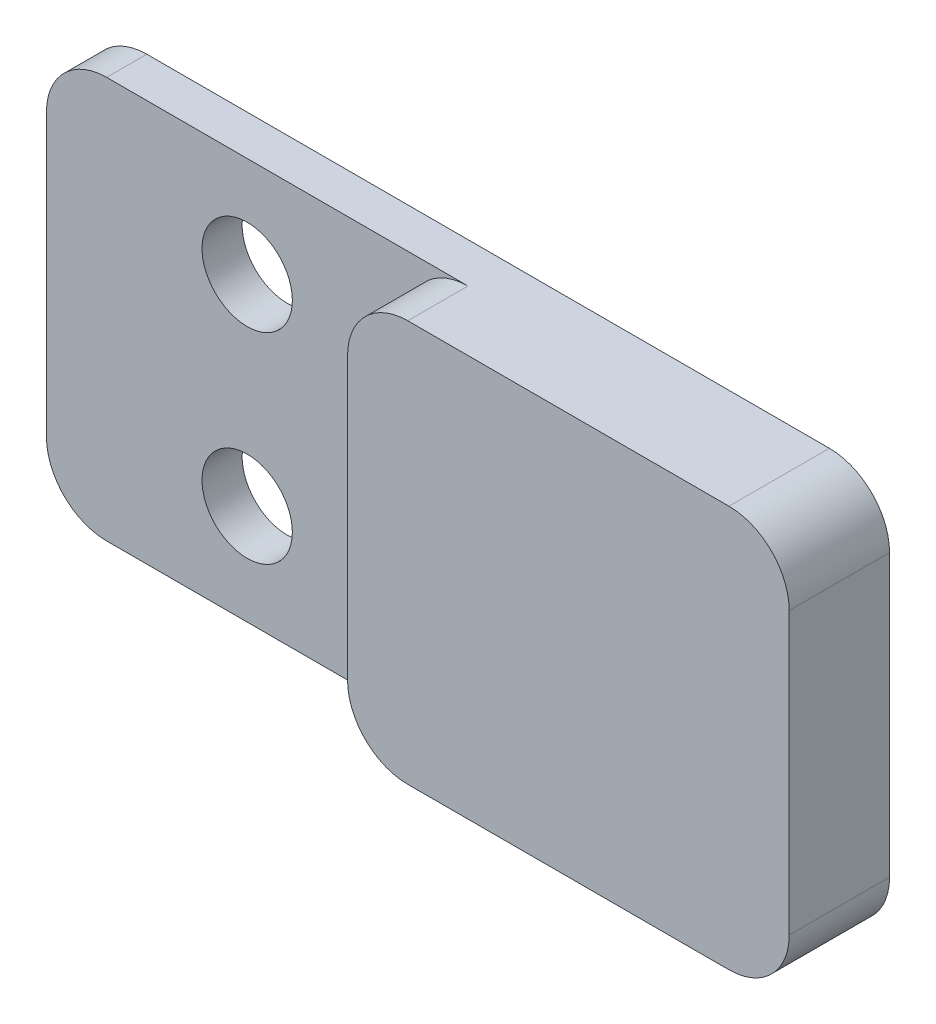
ISO-10303-21;
HEADER;
FILE_DESCRIPTION(('STEP AP214'),'2;1');
FILE_NAME('part.step','',(''),(''),'','','');
FILE_SCHEMA(('AUTOMOTIVE_DESIGN { 1 0 10303 214 1 1 1 1 }'));
ENDSEC;
DATA;
#1=APPLICATION_CONTEXT('core data for automotive mechanical design processes');
#2=APPLICATION_PROTOCOL_DEFINITION('international standard','automotive_design',2000,#1);
#3=PRODUCT_CONTEXT('',#1,'mechanical');
#4=PRODUCT('Part','Part','',(#3));
#5=PRODUCT_RELATED_PRODUCT_CATEGORY('part','',(#4));
#6=PRODUCT_DEFINITION_FORMATION('','',#4);
#7=PRODUCT_DEFINITION_CONTEXT('part definition',#1,'design');
#8=PRODUCT_DEFINITION('design','',#6,#7);
#9=PRODUCT_DEFINITION_SHAPE('','',#8);
#10=(LENGTH_UNIT() NAMED_UNIT(*) SI_UNIT(.MILLI.,.METRE.));
#11=(NAMED_UNIT(*) PLANE_ANGLE_UNIT() SI_UNIT($,.RADIAN.));
#12=(NAMED_UNIT(*) SI_UNIT($,.STERADIAN.) SOLID_ANGLE_UNIT());
#13=UNCERTAINTY_MEASURE_WITH_UNIT(LENGTH_MEASURE(1.E-05),#10,'distance_accuracy_value','');
#14=(GEOMETRIC_REPRESENTATION_CONTEXT(3) GLOBAL_UNCERTAINTY_ASSIGNED_CONTEXT((#13)) GLOBAL_UNIT_ASSIGNED_CONTEXT((#10,
#11,#12)) REPRESENTATION_CONTEXT('',''));
#15=CARTESIAN_POINT('',(0.,0.,0.));
#16=DIRECTION('',(0.,0.,1.));
#17=DIRECTION('',(1.,0.,0.));
#18=AXIS2_PLACEMENT_3D('',#15,#16,#17);
#19=CARTESIAN_POINT('',(20.494567618363,0.,2.));
#20=DIRECTION('',(1.,0.,0.));
#21=DIRECTION('',(0.,1.,0.));
#22=AXIS2_PLACEMENT_3D('',#19,#20,#21);
#23=PLANE('',#22);
#24=DIRECTION('',(0.,1.,0.));
#25=VECTOR('',#24,1.);
#26=CARTESIAN_POINT('',(20.494567618363,10.2863925862739,5.));
#27=LINE('',#26,#25);
#28=CARTESIAN_POINT('',(20.494567618363,-6.71360741372607,5.));
#29=VERTEX_POINT('',#28);
#30=CARTESIAN_POINT('',(20.494567618363,7.28639258627393,5.));
#31=VERTEX_POINT('',#30);
#32=EDGE_CURVE('E220',#29,#31,#27,.T.);
#33=ORIENTED_EDGE('',*,*,#32,.F.);
#34=DIRECTION('',(0.,0.,-1.));
#35=VECTOR('',#34,1.);
#36=CARTESIAN_POINT('',(20.494567618363,-6.71360741372607,0.));
#37=LINE('',#36,#35);
#38=CARTESIAN_POINT('',(20.494567618363,-6.71360741372607,0.));
#39=VERTEX_POINT('',#38);
#40=EDGE_CURVE('E195',#29,#39,#37,.T.);
#41=ORIENTED_EDGE('',*,*,#40,.T.);
#42=DIRECTION('',(0.,-1.,0.));
#43=VECTOR('',#42,1.);
#44=CARTESIAN_POINT('',(20.494567618363,0.,0.));
#45=LINE('',#44,#43);
#46=CARTESIAN_POINT('',(20.494567618363,7.28639258627393,0.));
#47=VERTEX_POINT('',#46);
#48=EDGE_CURVE('E242',#47,#39,#45,.T.);
#49=ORIENTED_EDGE('',*,*,#48,.F.);
#50=DIRECTION('',(0.,0.,-1.));
#51=VECTOR('',#50,1.);
#52=CARTESIAN_POINT('',(20.494567618363,7.28639258627393,2.));
#53=LINE('',#52,#51);
#54=EDGE_CURVE('E193',#47,#31,#53,.F.);
#55=ORIENTED_EDGE('',*,*,#54,.T.);
#56=EDGE_LOOP('',(#33,#41,#49,#55));
#57=FACE_BOUND('',#56,.T.);
#58=ADVANCED_FACE('F35',(#57),#23,.T.);
#59=CARTESIAN_POINT('',(0.,10.2863925862739,2.));
#60=DIRECTION('',(0.,1.,0.));
#61=DIRECTION('',(0.,0.,1.));
#62=AXIS2_PLACEMENT_3D('',#59,#60,#61);
#63=PLANE('',#62);
#64=DIRECTION('',(1.,0.,0.));
#65=VECTOR('',#64,1.);
#66=CARTESIAN_POINT('',(0.,10.2863925862739,2.));
#67=LINE('',#66,#65);
#68=CARTESIAN_POINT('',(-16.505432381637,10.2863925862739,2.));
#69=VERTEX_POINT('',#68);
#70=CARTESIAN_POINT('',(1.49456761836302,10.2863925862739,2.));
#71=VERTEX_POINT('',#70);
#72=EDGE_CURVE('E232',#69,#71,#67,.T.);
#73=ORIENTED_EDGE('',*,*,#72,.T.);
#74=DIRECTION('',(0.,0.,-1.));
#75=VECTOR('',#74,1.);
#76=CARTESIAN_POINT('',(1.49456761836302,10.2863925862739,5.));
#77=LINE('',#76,#75);
#78=CARTESIAN_POINT('',(1.49456761836302,10.2863925862739,5.));
#79=VERTEX_POINT('',#78);
#80=EDGE_CURVE('E180',#71,#79,#77,.F.);
#81=ORIENTED_EDGE('',*,*,#80,.T.);
#82=DIRECTION('',(-1.,0.,0.));
#83=VECTOR('',#82,1.);
#84=CARTESIAN_POINT('',(-1.50543238163698,10.2863925862739,5.));
#85=LINE('',#84,#83);
#86=CARTESIAN_POINT('',(17.494567618363,10.2863925862739,5.));
#87=VERTEX_POINT('',#86);
#88=EDGE_CURVE('E223',#87,#79,#85,.T.);
#89=ORIENTED_EDGE('',*,*,#88,.F.);
#90=DIRECTION('',(0.,0.,-1.));
#91=VECTOR('',#90,1.);
#92=CARTESIAN_POINT('',(17.494567618363,10.2863925862739,2.));
#93=LINE('',#92,#91);
#94=CARTESIAN_POINT('',(17.494567618363,10.2863925862739,0.));
#95=VERTEX_POINT('',#94);
#96=EDGE_CURVE('E177',#87,#95,#93,.T.);
#97=ORIENTED_EDGE('',*,*,#96,.T.);
#98=DIRECTION('',(1.,0.,0.));
#99=VECTOR('',#98,1.);
#100=CARTESIAN_POINT('',(0.,10.2863925862739,0.));
#101=LINE('',#100,#99);
#102=CARTESIAN_POINT('',(-16.505432381637,10.2863925862739,0.));
#103=VERTEX_POINT('',#102);
#104=EDGE_CURVE('E156',#103,#95,#101,.T.);
#105=ORIENTED_EDGE('',*,*,#104,.F.);
#106=DIRECTION('',(0.,0.,-1.));
#107=VECTOR('',#106,1.);
#108=CARTESIAN_POINT('',(-16.505432381637,10.2863925862739,2.));
#109=LINE('',#108,#107);
#110=EDGE_CURVE('E175',#103,#69,#109,.F.);
#111=ORIENTED_EDGE('',*,*,#110,.T.);
#112=EDGE_LOOP('',(#73,#81,#89,#97,#105,#111));
#113=FACE_BOUND('',#112,.T.);
#114=ADVANCED_FACE('F248',(#113),#63,.T.);
#115=CARTESIAN_POINT('',(-19.505432381637,0.,2.));
#116=DIRECTION('',(1.,0.,0.));
#117=DIRECTION('',(0.,1.,0.));
#118=AXIS2_PLACEMENT_3D('',#115,#116,#117);
#119=PLANE('',#118);
#120=DIRECTION('',(0.,-1.,0.));
#121=VECTOR('',#120,1.);
#122=CARTESIAN_POINT('',(-19.505432381637,0.,0.));
#123=LINE('',#122,#121);
#124=CARTESIAN_POINT('',(-19.505432381637,7.28639258627393,0.));
#125=VERTEX_POINT('',#124);
#126=CARTESIAN_POINT('',(-19.505432381637,-6.71360741372607,0.));
#127=VERTEX_POINT('',#126);
#128=EDGE_CURVE('E151',#125,#127,#123,.T.);
#129=ORIENTED_EDGE('',*,*,#128,.T.);
#130=DIRECTION('',(0.,0.,-1.));
#131=VECTOR('',#130,1.);
#132=CARTESIAN_POINT('',(-19.505432381637,-6.71360741372607,2.));
#133=LINE('',#132,#131);
#134=CARTESIAN_POINT('',(-19.505432381637,-6.71360741372607,2.));
#135=VERTEX_POINT('',#134);
#136=EDGE_CURVE('E50',#127,#135,#133,.F.);
#137=ORIENTED_EDGE('',*,*,#136,.T.);
#138=DIRECTION('',(0.,-1.,0.));
#139=VECTOR('',#138,1.);
#140=CARTESIAN_POINT('',(-19.505432381637,0.,2.));
#141=LINE('',#140,#139);
#142=CARTESIAN_POINT('',(-19.505432381637,7.28639258627393,2.));
#143=VERTEX_POINT('',#142);
#144=EDGE_CURVE('E234',#143,#135,#141,.T.);
#145=ORIENTED_EDGE('',*,*,#144,.F.);
#146=DIRECTION('',(0.,0.,-1.));
#147=VECTOR('',#146,1.);
#148=CARTESIAN_POINT('',(-19.505432381637,7.28639258627393,0.));
#149=LINE('',#148,#147);
#150=EDGE_CURVE('E133',#143,#125,#149,.T.);
#151=ORIENTED_EDGE('',*,*,#150,.T.);
#152=EDGE_LOOP('',(#129,#137,#145,#151));
#153=FACE_BOUND('',#152,.T.);
#154=ADVANCED_FACE('F253',(#153),#119,.F.);
#155=CARTESIAN_POINT('',(-9.50543238163698,5.28639258627393,2.));
#156=DIRECTION('',(0.,0.,-1.));
#157=DIRECTION('',(-1.,0.,0.));
#158=AXIS2_PLACEMENT_3D('',#155,#156,#157);
#159=CYLINDRICAL_SURFACE('',#158,2.25);
#160=CARTESIAN_POINT('',(-9.50543238163698,5.28639258627393,2.));
#161=DIRECTION('',(0.,0.,1.));
#162=DIRECTION('',(1.,0.,0.));
#163=AXIS2_PLACEMENT_3D('',#160,#161,#162);
#164=CIRCLE('',#163,2.25);
#165=CARTESIAN_POINT('',(-7.25543238163698,5.28639258627393,2.));
#166=VERTEX_POINT('',#165);
#167=EDGE_CURVE('E154',#166,#166,#164,.T.);
#168=ORIENTED_EDGE('',*,*,#167,.T.);
#169=EDGE_LOOP('',(#168));
#170=FACE_BOUND('',#169,.T.);
#171=CARTESIAN_POINT('',(-9.50543238163698,5.28639258627393,0.));
#172=DIRECTION('',(0.,0.,1.));
#173=DIRECTION('',(1.,0.,0.));
#174=AXIS2_PLACEMENT_3D('',#171,#172,#173);
#175=CIRCLE('',#174,2.25);
#176=CARTESIAN_POINT('',(-7.25543238163698,5.28639258627393,0.));
#177=VERTEX_POINT('',#176);
#178=EDGE_CURVE('E239',#177,#177,#175,.T.);
#179=ORIENTED_EDGE('',*,*,#178,.F.);
#180=EDGE_LOOP('',(#179));
#181=FACE_BOUND('',#180,.T.);
#182=ADVANCED_FACE('F255',(#170,#181),#159,.F.);
#183=CARTESIAN_POINT('',(-9.50543238163698,-4.71360741372608,2.));
#184=DIRECTION('',(0.,0.,-1.));
#185=DIRECTION('',(-1.,0.,0.));
#186=AXIS2_PLACEMENT_3D('',#183,#184,#185);
#187=CYLINDRICAL_SURFACE('',#186,2.25);
#188=CARTESIAN_POINT('',(-9.50543238163698,-4.71360741372608,2.));
#189=DIRECTION('',(0.,0.,1.));
#190=DIRECTION('',(1.,0.,0.));
#191=AXIS2_PLACEMENT_3D('',#188,#189,#190);
#192=CIRCLE('',#191,2.25);
#193=CARTESIAN_POINT('',(-7.25543238163698,-4.71360741372608,2.));
#194=VERTEX_POINT('',#193);
#195=EDGE_CURVE('E150',#194,#194,#192,.T.);
#196=ORIENTED_EDGE('',*,*,#195,.T.);
#197=EDGE_LOOP('',(#196));
#198=FACE_BOUND('',#197,.T.);
#199=CARTESIAN_POINT('',(-9.50543238163698,-4.71360741372608,0.));
#200=DIRECTION('',(0.,0.,1.));
#201=DIRECTION('',(1.,0.,0.));
#202=AXIS2_PLACEMENT_3D('',#199,#200,#201);
#203=CIRCLE('',#202,2.25);
#204=CARTESIAN_POINT('',(-7.25543238163698,-4.71360741372608,0.));
#205=VERTEX_POINT('',#204);
#206=EDGE_CURVE('E228',#205,#205,#203,.T.);
#207=ORIENTED_EDGE('',*,*,#206,.F.);
#208=EDGE_LOOP('',(#207));
#209=FACE_BOUND('',#208,.T.);
#210=ADVANCED_FACE('F261',(#198,#209),#187,.F.);
#211=CARTESIAN_POINT('',(0.,-9.71360741372607,2.));
#212=DIRECTION('',(0.,1.,0.));
#213=DIRECTION('',(0.,0.,1.));
#214=AXIS2_PLACEMENT_3D('',#211,#212,#213);
#215=PLANE('',#214);
#216=DIRECTION('',(1.,0.,0.));
#217=VECTOR('',#216,1.);
#218=CARTESIAN_POINT('',(-1.50543238163697,-9.71360741372607,5.));
#219=LINE('',#218,#217);
#220=CARTESIAN_POINT('',(1.49456761836303,-9.71360741372607,5.));
#221=VERTEX_POINT('',#220);
#222=CARTESIAN_POINT('',(17.494567618363,-9.71360741372607,5.));
#223=VERTEX_POINT('',#222);
#224=EDGE_CURVE('E218',#221,#223,#219,.T.);
#225=ORIENTED_EDGE('',*,*,#224,.F.);
#226=DIRECTION('',(0.,0.,-1.));
#227=VECTOR('',#226,1.);
#228=CARTESIAN_POINT('',(1.49456761836303,-9.71360741372607,2.));
#229=LINE('',#228,#227);
#230=CARTESIAN_POINT('',(1.49456761836303,-9.71360741372607,2.));
#231=VERTEX_POINT('',#230);
#232=EDGE_CURVE('E145',#221,#231,#229,.T.);
#233=ORIENTED_EDGE('',*,*,#232,.T.);
#234=DIRECTION('',(1.,0.,0.));
#235=VECTOR('',#234,1.);
#236=CARTESIAN_POINT('',(0.,-9.71360741372607,2.));
#237=LINE('',#236,#235);
#238=CARTESIAN_POINT('',(-16.505432381637,-9.71360741372607,2.));
#239=VERTEX_POINT('',#238);
#240=EDGE_CURVE('E144',#239,#231,#237,.T.);
#241=ORIENTED_EDGE('',*,*,#240,.F.);
#242=DIRECTION('',(0.,0.,-1.));
#243=VECTOR('',#242,1.);
#244=CARTESIAN_POINT('',(-16.505432381637,-9.71360741372607,2.));
#245=LINE('',#244,#243);
#246=CARTESIAN_POINT('',(-16.505432381637,-9.71360741372607,0.));
#247=VERTEX_POINT('',#246);
#248=EDGE_CURVE('E129',#239,#247,#245,.T.);
#249=ORIENTED_EDGE('',*,*,#248,.T.);
#250=DIRECTION('',(1.,0.,0.));
#251=VECTOR('',#250,1.);
#252=CARTESIAN_POINT('',(0.,-9.71360741372607,0.));
#253=LINE('',#252,#251);
#254=CARTESIAN_POINT('',(17.494567618363,-9.71360741372607,0.));
#255=VERTEX_POINT('',#254);
#256=EDGE_CURVE('E141',#247,#255,#253,.T.);
#257=ORIENTED_EDGE('',*,*,#256,.T.);
#258=DIRECTION('',(0.,0.,-1.));
#259=VECTOR('',#258,1.);
#260=CARTESIAN_POINT('',(17.494567618363,-9.71360741372607,5.));
#261=LINE('',#260,#259);
#262=EDGE_CURVE('E146',#255,#223,#261,.F.);
#263=ORIENTED_EDGE('',*,*,#262,.T.);
#264=EDGE_LOOP('',(#225,#233,#241,#249,#257,#263));
#265=FACE_BOUND('',#264,.T.);
#266=ADVANCED_FACE('F140',(#265),#215,.F.);
#267=CARTESIAN_POINT('',(0.,0.,2.));
#268=DIRECTION('',(0.,0.,1.));
#269=DIRECTION('',(1.,0.,0.));
#270=AXIS2_PLACEMENT_3D('',#267,#268,#269);
#271=PLANE('',#270);
#272=ORIENTED_EDGE('',*,*,#144,.T.);
#273=CARTESIAN_POINT('',(-16.505432381637,-6.71360741372607,2.));
#274=DIRECTION('',(0.,0.,1.));
#275=DIRECTION('',(1.,0.,0.));
#276=AXIS2_PLACEMENT_3D('',#273,#274,#275);
#277=CIRCLE('',#276,3.);
#278=EDGE_CURVE('E191',#135,#239,#277,.T.);
#279=ORIENTED_EDGE('',*,*,#278,.T.);
#280=ORIENTED_EDGE('',*,*,#240,.T.);
#281=CARTESIAN_POINT('',(1.49456761836303,-6.71360741372607,2.));
#282=DIRECTION('',(0.,0.,1.));
#283=DIRECTION('',(1.,0.,0.));
#284=AXIS2_PLACEMENT_3D('',#281,#282,#283);
#285=CIRCLE('',#284,3.);
#286=CARTESIAN_POINT('',(-1.50543238163697,-6.71360741372607,2.));
#287=VERTEX_POINT('',#286);
#288=EDGE_CURVE('E43',#231,#287,#285,.F.);
#289=ORIENTED_EDGE('',*,*,#288,.T.);
#290=DIRECTION('',(0.,-1.,0.));
#291=VECTOR('',#290,1.);
#292=CARTESIAN_POINT('',(-1.50543238163698,10.2863925862739,2.));
#293=LINE('',#292,#291);
#294=CARTESIAN_POINT('',(-1.50543238163698,7.28639258627393,2.));
#295=VERTEX_POINT('',#294);
#296=EDGE_CURVE('E202',#295,#287,#293,.T.);
#297=ORIENTED_EDGE('',*,*,#296,.F.);
#298=CARTESIAN_POINT('',(1.49456761836302,7.28639258627393,2.));
#299=DIRECTION('',(0.,0.,1.));
#300=DIRECTION('',(1.,0.,0.));
#301=AXIS2_PLACEMENT_3D('',#298,#299,#300);
#302=CIRCLE('',#301,3.);
#303=EDGE_CURVE('E11',#295,#71,#302,.F.);
#304=ORIENTED_EDGE('',*,*,#303,.T.);
#305=ORIENTED_EDGE('',*,*,#72,.F.);
#306=CARTESIAN_POINT('',(-16.505432381637,7.28639258627393,2.));
#307=DIRECTION('',(0.,0.,1.));
#308=DIRECTION('',(1.,0.,0.));
#309=AXIS2_PLACEMENT_3D('',#306,#307,#308);
#310=CIRCLE('',#309,3.);
#311=EDGE_CURVE('E57',#69,#143,#310,.T.);
#312=ORIENTED_EDGE('',*,*,#311,.T.);
#313=EDGE_LOOP('',(#272,#279,#280,#289,#297,#304,#305,#312));
#314=FACE_BOUND('',#313,.T.);
#315=ORIENTED_EDGE('',*,*,#195,.F.);
#316=EDGE_LOOP('',(#315));
#317=FACE_BOUND('',#316,.T.);
#318=ORIENTED_EDGE('',*,*,#167,.F.);
#319=EDGE_LOOP('',(#318));
#320=FACE_BOUND('',#319,.T.);
#321=ADVANCED_FACE('F200',(#314,#317,#320),#271,.T.);
#322=CARTESIAN_POINT('',(0.,0.,0.));
#323=DIRECTION('',(0.,0.,1.));
#324=DIRECTION('',(1.,0.,0.));
#325=AXIS2_PLACEMENT_3D('',#322,#323,#324);
#326=PLANE('',#325);
#327=ORIENTED_EDGE('',*,*,#206,.T.);
#328=EDGE_LOOP('',(#327));
#329=FACE_BOUND('',#328,.T.);
#330=ORIENTED_EDGE('',*,*,#178,.T.);
#331=EDGE_LOOP('',(#330));
#332=FACE_BOUND('',#331,.T.);
#333=ORIENTED_EDGE('',*,*,#256,.F.);
#334=CARTESIAN_POINT('',(-16.505432381637,-6.71360741372607,0.));
#335=DIRECTION('',(0.,0.,1.));
#336=DIRECTION('',(1.,0.,0.));
#337=AXIS2_PLACEMENT_3D('',#334,#335,#336);
#338=CIRCLE('',#337,3.);
#339=EDGE_CURVE('E125',#247,#127,#338,.F.);
#340=ORIENTED_EDGE('',*,*,#339,.T.);
#341=ORIENTED_EDGE('',*,*,#128,.F.);
#342=CARTESIAN_POINT('',(-16.505432381637,7.28639258627393,0.));
#343=DIRECTION('',(0.,0.,1.));
#344=DIRECTION('',(1.,0.,0.));
#345=AXIS2_PLACEMENT_3D('',#342,#343,#344);
#346=CIRCLE('',#345,3.);
#347=EDGE_CURVE('E182',#125,#103,#346,.F.);
#348=ORIENTED_EDGE('',*,*,#347,.T.);
#349=ORIENTED_EDGE('',*,*,#104,.T.);
#350=CARTESIAN_POINT('',(17.494567618363,7.28639258627393,0.));
#351=DIRECTION('',(0.,0.,1.));
#352=DIRECTION('',(1.,0.,0.));
#353=AXIS2_PLACEMENT_3D('',#350,#351,#352);
#354=CIRCLE('',#353,3.);
#355=EDGE_CURVE('E184',#95,#47,#354,.F.);
#356=ORIENTED_EDGE('',*,*,#355,.T.);
#357=ORIENTED_EDGE('',*,*,#48,.T.);
#358=CARTESIAN_POINT('',(17.494567618363,-6.71360741372607,0.));
#359=DIRECTION('',(0.,0.,1.));
#360=DIRECTION('',(1.,0.,0.));
#361=AXIS2_PLACEMENT_3D('',#358,#359,#360);
#362=CIRCLE('',#361,3.);
#363=EDGE_CURVE('E134',#39,#255,#362,.F.);
#364=ORIENTED_EDGE('',*,*,#363,.T.);
#365=EDGE_LOOP('',(#333,#340,#341,#348,#349,#356,#357,#364));
#366=FACE_BOUND('',#365,.T.);
#367=ADVANCED_FACE('F148',(#329,#332,#366),#326,.F.);
#368=CARTESIAN_POINT('',(-1.50543238163698,10.2863925862739,5.));
#369=DIRECTION('',(1.,0.,0.));
#370=DIRECTION('',(0.,1.,0.));
#371=AXIS2_PLACEMENT_3D('',#368,#369,#370);
#372=PLANE('',#371);
#373=ORIENTED_EDGE('',*,*,#296,.T.);
#374=DIRECTION('',(0.,0.,-1.));
#375=VECTOR('',#374,1.);
#376=CARTESIAN_POINT('',(-1.50543238163697,-6.71360741372607,5.));
#377=LINE('',#376,#375);
#378=CARTESIAN_POINT('',(-1.50543238163697,-6.71360741372607,5.));
#379=VERTEX_POINT('',#378);
#380=EDGE_CURVE('E165',#287,#379,#377,.F.);
#381=ORIENTED_EDGE('',*,*,#380,.T.);
#382=DIRECTION('',(0.,-1.,0.));
#383=VECTOR('',#382,1.);
#384=CARTESIAN_POINT('',(-1.50543238163698,10.2863925862739,5.));
#385=LINE('',#384,#383);
#386=CARTESIAN_POINT('',(-1.50543238163698,7.28639258627393,5.));
#387=VERTEX_POINT('',#386);
#388=EDGE_CURVE('E211',#387,#379,#385,.T.);
#389=ORIENTED_EDGE('',*,*,#388,.F.);
#390=DIRECTION('',(0.,0.,-1.));
#391=VECTOR('',#390,1.);
#392=CARTESIAN_POINT('',(-1.50543238163698,7.28639258627393,2.));
#393=LINE('',#392,#391);
#394=EDGE_CURVE('E162',#387,#295,#393,.T.);
#395=ORIENTED_EDGE('',*,*,#394,.T.);
#396=EDGE_LOOP('',(#373,#381,#389,#395));
#397=FACE_BOUND('',#396,.T.);
#398=ADVANCED_FACE('F207',(#397),#372,.F.);
#399=CARTESIAN_POINT('',(0.,0.,5.));
#400=DIRECTION('',(0.,0.,1.));
#401=DIRECTION('',(1.,0.,0.));
#402=AXIS2_PLACEMENT_3D('',#399,#400,#401);
#403=PLANE('',#402);
#404=ORIENTED_EDGE('',*,*,#388,.T.);
#405=CARTESIAN_POINT('',(1.49456761836303,-6.71360741372607,5.));
#406=DIRECTION('',(0.,0.,1.));
#407=DIRECTION('',(1.,0.,0.));
#408=AXIS2_PLACEMENT_3D('',#405,#406,#407);
#409=CIRCLE('',#408,3.);
#410=EDGE_CURVE('E173',#379,#221,#409,.T.);
#411=ORIENTED_EDGE('',*,*,#410,.T.);
#412=ORIENTED_EDGE('',*,*,#224,.T.);
#413=CARTESIAN_POINT('',(17.494567618363,-6.71360741372607,5.));
#414=DIRECTION('',(0.,0.,1.));
#415=DIRECTION('',(1.,0.,0.));
#416=AXIS2_PLACEMENT_3D('',#413,#414,#415);
#417=CIRCLE('',#416,3.);
#418=EDGE_CURVE('E169',#223,#29,#417,.T.);
#419=ORIENTED_EDGE('',*,*,#418,.T.);
#420=ORIENTED_EDGE('',*,*,#32,.T.);
#421=CARTESIAN_POINT('',(17.494567618363,7.28639258627393,5.));
#422=DIRECTION('',(0.,0.,1.));
#423=DIRECTION('',(1.,0.,0.));
#424=AXIS2_PLACEMENT_3D('',#421,#422,#423);
#425=CIRCLE('',#424,3.);
#426=EDGE_CURVE('E167',#31,#87,#425,.T.);
#427=ORIENTED_EDGE('',*,*,#426,.T.);
#428=ORIENTED_EDGE('',*,*,#88,.T.);
#429=CARTESIAN_POINT('',(1.49456761836302,7.28639258627393,5.));
#430=DIRECTION('',(0.,0.,1.));
#431=DIRECTION('',(1.,0.,0.));
#432=AXIS2_PLACEMENT_3D('',#429,#430,#431);
#433=CIRCLE('',#432,3.);
#434=EDGE_CURVE('E171',#79,#387,#433,.T.);
#435=ORIENTED_EDGE('',*,*,#434,.T.);
#436=EDGE_LOOP('',(#404,#411,#412,#419,#420,#427,#428,#435));
#437=FACE_BOUND('',#436,.T.);
#438=ADVANCED_FACE('F217',(#437),#403,.T.);
#439=CARTESIAN_POINT('',(1.49456761836303,-6.71360741372607,2.));
#440=DIRECTION('',(0.,0.,-1.));
#441=DIRECTION('',(-1.,0.,0.));
#442=AXIS2_PLACEMENT_3D('',#439,#440,#441);
#443=CYLINDRICAL_SURFACE('',#442,3.);
#444=ORIENTED_EDGE('',*,*,#410,.F.);
#445=ORIENTED_EDGE('',*,*,#380,.F.);
#446=ORIENTED_EDGE('',*,*,#288,.F.);
#447=ORIENTED_EDGE('',*,*,#232,.F.);
#448=EDGE_LOOP('',(#444,#445,#446,#447));
#449=FACE_BOUND('',#448,.T.);
#450=ADVANCED_FACE('F214',(#449),#443,.T.);
#451=CARTESIAN_POINT('',(1.49456761836302,7.28639258627393,5.));
#452=DIRECTION('',(0.,0.,1.));
#453=DIRECTION('',(1.,0.,0.));
#454=AXIS2_PLACEMENT_3D('',#451,#452,#453);
#455=CYLINDRICAL_SURFACE('',#454,3.);
#456=ORIENTED_EDGE('',*,*,#434,.F.);
#457=ORIENTED_EDGE('',*,*,#80,.F.);
#458=ORIENTED_EDGE('',*,*,#303,.F.);
#459=ORIENTED_EDGE('',*,*,#394,.F.);
#460=EDGE_LOOP('',(#456,#457,#458,#459));
#461=FACE_BOUND('',#460,.T.);
#462=ADVANCED_FACE('F278',(#461),#455,.T.);
#463=CARTESIAN_POINT('',(-16.505432381637,-6.71360741372607,2.));
#464=DIRECTION('',(0.,0.,-1.));
#465=DIRECTION('',(-1.,0.,0.));
#466=AXIS2_PLACEMENT_3D('',#463,#464,#465);
#467=CYLINDRICAL_SURFACE('',#466,3.);
#468=ORIENTED_EDGE('',*,*,#278,.F.);
#469=ORIENTED_EDGE('',*,*,#136,.F.);
#470=ORIENTED_EDGE('',*,*,#339,.F.);
#471=ORIENTED_EDGE('',*,*,#248,.F.);
#472=EDGE_LOOP('',(#468,#469,#470,#471));
#473=FACE_BOUND('',#472,.T.);
#474=ADVANCED_FACE('F128',(#473),#467,.T.);
#475=CARTESIAN_POINT('',(17.494567618363,-6.71360741372607,2.));
#476=DIRECTION('',(0.,0.,1.));
#477=DIRECTION('',(1.,0.,0.));
#478=AXIS2_PLACEMENT_3D('',#475,#476,#477);
#479=CYLINDRICAL_SURFACE('',#478,3.);
#480=ORIENTED_EDGE('',*,*,#418,.F.);
#481=ORIENTED_EDGE('',*,*,#262,.F.);
#482=ORIENTED_EDGE('',*,*,#363,.F.);
#483=ORIENTED_EDGE('',*,*,#40,.F.);
#484=EDGE_LOOP('',(#480,#481,#482,#483));
#485=FACE_BOUND('',#484,.T.);
#486=ADVANCED_FACE('F284',(#485),#479,.T.);
#487=CARTESIAN_POINT('',(17.494567618363,7.28639258627393,2.));
#488=DIRECTION('',(0.,0.,-1.));
#489=DIRECTION('',(-1.,0.,0.));
#490=AXIS2_PLACEMENT_3D('',#487,#488,#489);
#491=CYLINDRICAL_SURFACE('',#490,3.);
#492=ORIENTED_EDGE('',*,*,#426,.F.);
#493=ORIENTED_EDGE('',*,*,#54,.F.);
#494=ORIENTED_EDGE('',*,*,#355,.F.);
#495=ORIENTED_EDGE('',*,*,#96,.F.);
#496=EDGE_LOOP('',(#492,#493,#494,#495));
#497=FACE_BOUND('',#496,.T.);
#498=ADVANCED_FACE('F286',(#497),#491,.T.);
#499=CARTESIAN_POINT('',(-16.505432381637,7.28639258627393,2.));
#500=DIRECTION('',(0.,0.,1.));
#501=DIRECTION('',(1.,0.,0.));
#502=AXIS2_PLACEMENT_3D('',#499,#500,#501);
#503=CYLINDRICAL_SURFACE('',#502,3.);
#504=ORIENTED_EDGE('',*,*,#311,.F.);
#505=ORIENTED_EDGE('',*,*,#110,.F.);
#506=ORIENTED_EDGE('',*,*,#347,.F.);
#507=ORIENTED_EDGE('',*,*,#150,.F.);
#508=EDGE_LOOP('',(#504,#505,#506,#507));
#509=FACE_BOUND('',#508,.T.);
#510=ADVANCED_FACE('F37',(#509),#503,.T.);
#511=CLOSED_SHELL('',(#58,#114,#154,#182,#210,#266,#321,#367,#398,#438,#450,#462,#474,#486,#498,#510));
#512=MANIFOLD_SOLID_BREP('B2',#511);
#513=ADVANCED_BREP_SHAPE_REPRESENTATION('',(#18,#512),#14);
#514=SHAPE_DEFINITION_REPRESENTATION(#9,#513);
ENDSEC;
END-ISO-10303-21;
